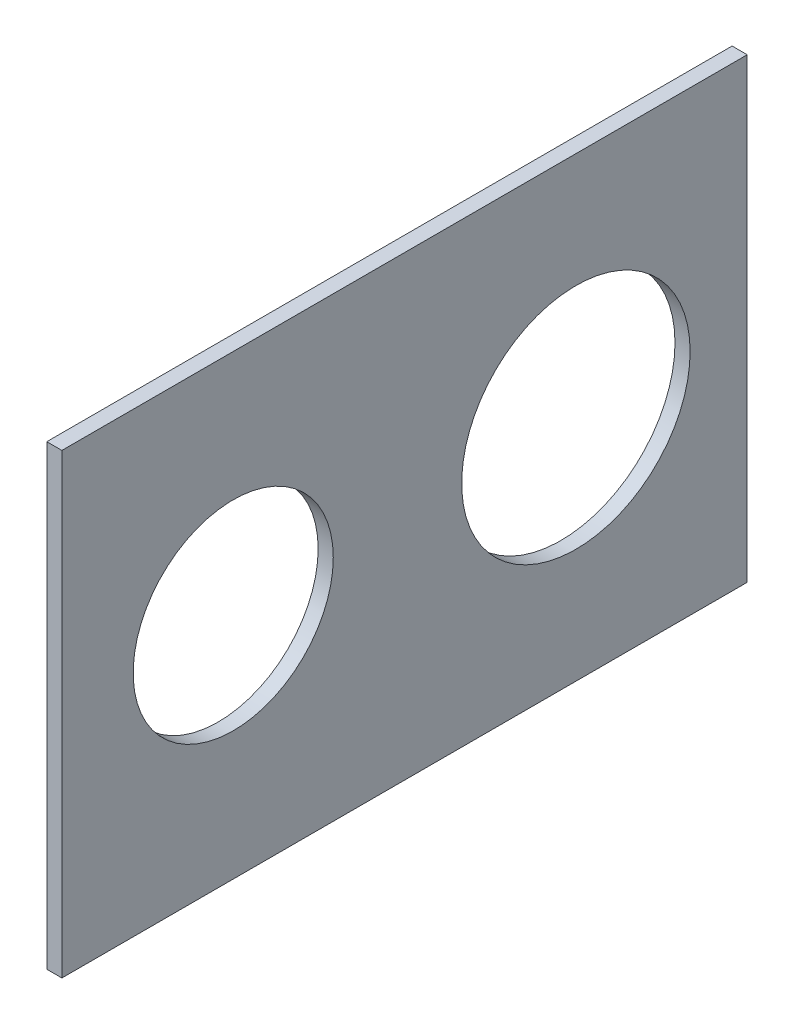
ISO-10303-21;
HEADER;
FILE_DESCRIPTION(('STEP AP214'),'2;1');
FILE_NAME('part.step','',(''),(''),'','','');
FILE_SCHEMA(('AUTOMOTIVE_DESIGN { 1 0 10303 214 1 1 1 1 }'));
ENDSEC;
DATA;
#1=APPLICATION_CONTEXT('core data for automotive mechanical design processes');
#2=APPLICATION_PROTOCOL_DEFINITION('international standard','automotive_design',2000,#1);
#3=PRODUCT_CONTEXT('',#1,'mechanical');
#4=PRODUCT('Part','Part','',(#3));
#5=PRODUCT_RELATED_PRODUCT_CATEGORY('part','',(#4));
#6=PRODUCT_DEFINITION_FORMATION('','',#4);
#7=PRODUCT_DEFINITION_CONTEXT('part definition',#1,'design');
#8=PRODUCT_DEFINITION('design','',#6,#7);
#9=PRODUCT_DEFINITION_SHAPE('','',#8);
#10=(LENGTH_UNIT() NAMED_UNIT(*) SI_UNIT(.MILLI.,.METRE.));
#11=(NAMED_UNIT(*) PLANE_ANGLE_UNIT() SI_UNIT($,.RADIAN.));
#12=(NAMED_UNIT(*) SI_UNIT($,.STERADIAN.) SOLID_ANGLE_UNIT());
#13=UNCERTAINTY_MEASURE_WITH_UNIT(LENGTH_MEASURE(1.E-05),#10,'distance_accuracy_value','');
#14=(GEOMETRIC_REPRESENTATION_CONTEXT(3) GLOBAL_UNCERTAINTY_ASSIGNED_CONTEXT((#13)) GLOBAL_UNIT_ASSIGNED_CONTEXT((#10,
#11,#12)) REPRESENTATION_CONTEXT('',''));
#15=CARTESIAN_POINT('',(0.,0.,0.));
#16=DIRECTION('',(0.,0.,1.));
#17=DIRECTION('',(1.,0.,0.));
#18=AXIS2_PLACEMENT_3D('',#15,#16,#17);
#19=CARTESIAN_POINT('',(1.68121921487946,0.,0.));
#20=DIRECTION('',(0.,0.,1.));
#21=DIRECTION('',(1.,0.,0.));
#22=AXIS2_PLACEMENT_3D('',#19,#20,#21);
#23=PLANE('',#22);
#24=DIRECTION('',(0.,1.,0.));
#25=VECTOR('',#24,1.);
#26=CARTESIAN_POINT('',(0.,0.,0.));
#27=LINE('',#26,#25);
#28=CARTESIAN_POINT('',(0.,0.,0.));
#29=VERTEX_POINT('',#28);
#30=CARTESIAN_POINT('',(0.,50.8,0.));
#31=VERTEX_POINT('',#30);
#32=EDGE_CURVE('E116',#29,#31,#27,.T.);
#33=ORIENTED_EDGE('',*,*,#32,.T.);
#34=DIRECTION('',(-1.,0.,0.));
#35=VECTOR('',#34,1.);
#36=CARTESIAN_POINT('',(1.68121921487946,50.8,0.));
#37=LINE('',#36,#35);
#38=CARTESIAN_POINT('',(1.68121921487946,50.8,0.));
#39=VERTEX_POINT('',#38);
#40=EDGE_CURVE('E11',#39,#31,#37,.T.);
#41=ORIENTED_EDGE('',*,*,#40,.F.);
#42=DIRECTION('',(0.,1.,0.));
#43=VECTOR('',#42,1.);
#44=CARTESIAN_POINT('',(1.68121921487946,0.,0.));
#45=LINE('',#44,#43);
#46=CARTESIAN_POINT('',(1.68121921487946,0.,0.));
#47=VERTEX_POINT('',#46);
#48=EDGE_CURVE('E97',#47,#39,#45,.T.);
#49=ORIENTED_EDGE('',*,*,#48,.F.);
#50=DIRECTION('',(-1.,0.,0.));
#51=VECTOR('',#50,1.);
#52=CARTESIAN_POINT('',(1.68121921487946,0.,0.));
#53=LINE('',#52,#51);
#54=EDGE_CURVE('E68',#47,#29,#53,.T.);
#55=ORIENTED_EDGE('',*,*,#54,.T.);
#56=EDGE_LOOP('',(#33,#41,#49,#55));
#57=FACE_BOUND('',#56,.T.);
#58=ADVANCED_FACE('F47',(#57),#23,.F.);
#59=CARTESIAN_POINT('',(1.68121921487946,50.8,0.));
#60=DIRECTION('',(0.,-1.,0.));
#61=DIRECTION('',(0.,0.,-1.));
#62=AXIS2_PLACEMENT_3D('',#59,#60,#61);
#63=PLANE('',#62);
#64=DIRECTION('',(0.,0.,1.));
#65=VECTOR('',#64,1.);
#66=CARTESIAN_POINT('',(0.,50.8,0.));
#67=LINE('',#66,#65);
#68=CARTESIAN_POINT('',(0.,50.8,76.2));
#69=VERTEX_POINT('',#68);
#70=EDGE_CURVE('E104',#31,#69,#67,.T.);
#71=ORIENTED_EDGE('',*,*,#70,.T.);
#72=DIRECTION('',(-1.,0.,0.));
#73=VECTOR('',#72,1.);
#74=CARTESIAN_POINT('',(1.68121921487946,50.8,76.2));
#75=LINE('',#74,#73);
#76=CARTESIAN_POINT('',(1.68121921487946,50.8,76.2));
#77=VERTEX_POINT('',#76);
#78=EDGE_CURVE('E59',#77,#69,#75,.T.);
#79=ORIENTED_EDGE('',*,*,#78,.F.);
#80=DIRECTION('',(0.,0.,1.));
#81=VECTOR('',#80,1.);
#82=CARTESIAN_POINT('',(1.68121921487946,50.8,0.));
#83=LINE('',#82,#81);
#84=EDGE_CURVE('E93',#39,#77,#83,.T.);
#85=ORIENTED_EDGE('',*,*,#84,.F.);
#86=ORIENTED_EDGE('',*,*,#40,.T.);
#87=EDGE_LOOP('',(#71,#79,#85,#86));
#88=FACE_BOUND('',#87,.T.);
#89=ADVANCED_FACE('F102',(#88),#63,.F.);
#90=CARTESIAN_POINT('',(1.68121921487946,0.,76.2));
#91=DIRECTION('',(0.,0.,1.));
#92=DIRECTION('',(1.,0.,0.));
#93=AXIS2_PLACEMENT_3D('',#90,#91,#92);
#94=PLANE('',#93);
#95=DIRECTION('',(0.,1.,0.));
#96=VECTOR('',#95,1.);
#97=CARTESIAN_POINT('',(0.,0.,76.2));
#98=LINE('',#97,#96);
#99=CARTESIAN_POINT('',(0.,0.,76.2));
#100=VERTEX_POINT('',#99);
#101=EDGE_CURVE('E122',#100,#69,#98,.T.);
#102=ORIENTED_EDGE('',*,*,#101,.F.);
#103=DIRECTION('',(-1.,0.,0.));
#104=VECTOR('',#103,1.);
#105=CARTESIAN_POINT('',(1.68121921487946,0.,76.2));
#106=LINE('',#105,#104);
#107=CARTESIAN_POINT('',(1.68121921487946,0.,76.2));
#108=VERTEX_POINT('',#107);
#109=EDGE_CURVE('E77',#108,#100,#106,.T.);
#110=ORIENTED_EDGE('',*,*,#109,.F.);
#111=DIRECTION('',(0.,1.,0.));
#112=VECTOR('',#111,1.);
#113=CARTESIAN_POINT('',(1.68121921487946,0.,76.2));
#114=LINE('',#113,#112);
#115=EDGE_CURVE('E98',#108,#77,#114,.T.);
#116=ORIENTED_EDGE('',*,*,#115,.T.);
#117=ORIENTED_EDGE('',*,*,#78,.T.);
#118=EDGE_LOOP('',(#102,#110,#116,#117));
#119=FACE_BOUND('',#118,.T.);
#120=ADVANCED_FACE('F108',(#119),#94,.T.);
#121=CARTESIAN_POINT('',(1.68121921487946,0.,0.));
#122=DIRECTION('',(0.,-1.,0.));
#123=DIRECTION('',(0.,0.,-1.));
#124=AXIS2_PLACEMENT_3D('',#121,#122,#123);
#125=PLANE('',#124);
#126=DIRECTION('',(0.,0.,1.));
#127=VECTOR('',#126,1.);
#128=CARTESIAN_POINT('',(0.,0.,0.));
#129=LINE('',#128,#127);
#130=EDGE_CURVE('E127',#29,#100,#129,.T.);
#131=ORIENTED_EDGE('',*,*,#130,.F.);
#132=ORIENTED_EDGE('',*,*,#54,.F.);
#133=DIRECTION('',(0.,0.,1.));
#134=VECTOR('',#133,1.);
#135=CARTESIAN_POINT('',(1.68121921487946,0.,0.));
#136=LINE('',#135,#134);
#137=EDGE_CURVE('E112',#47,#108,#136,.T.);
#138=ORIENTED_EDGE('',*,*,#137,.T.);
#139=ORIENTED_EDGE('',*,*,#109,.T.);
#140=EDGE_LOOP('',(#131,#132,#138,#139));
#141=FACE_BOUND('',#140,.T.);
#142=ADVANCED_FACE('F163',(#141),#125,.T.);
#143=CARTESIAN_POINT('',(1.68121921487946,0.,0.));
#144=DIRECTION('',(1.,0.,0.));
#145=DIRECTION('',(0.,0.,-1.));
#146=AXIS2_PLACEMENT_3D('',#143,#144,#145);
#147=PLANE('',#146);
#148=CARTESIAN_POINT('',(1.68121921487946,25.4,57.15));
#149=DIRECTION('',(1.,0.,0.));
#150=DIRECTION('',(0.,0.,-1.));
#151=AXIS2_PLACEMENT_3D('',#148,#149,#150);
#152=CIRCLE('',#151,11.1252);
#153=CARTESIAN_POINT('',(1.68121921487946,25.4,46.0248));
#154=VERTEX_POINT('',#153);
#155=EDGE_CURVE('E145',#154,#154,#152,.T.);
#156=ORIENTED_EDGE('',*,*,#155,.F.);
#157=EDGE_LOOP('',(#156));
#158=FACE_BOUND('',#157,.T.);
#159=CARTESIAN_POINT('',(1.68121921487946,25.4,19.05));
#160=DIRECTION('',(1.,0.,0.));
#161=DIRECTION('',(0.,0.,-1.));
#162=AXIS2_PLACEMENT_3D('',#159,#160,#161);
#163=CIRCLE('',#162,12.7);
#164=CARTESIAN_POINT('',(1.68121921487946,25.4,6.35));
#165=VERTEX_POINT('',#164);
#166=EDGE_CURVE('E136',#165,#165,#163,.T.);
#167=ORIENTED_EDGE('',*,*,#166,.F.);
#168=EDGE_LOOP('',(#167));
#169=FACE_BOUND('',#168,.T.);
#170=ORIENTED_EDGE('',*,*,#48,.T.);
#171=ORIENTED_EDGE('',*,*,#84,.T.);
#172=ORIENTED_EDGE('',*,*,#115,.F.);
#173=ORIENTED_EDGE('',*,*,#137,.F.);
#174=EDGE_LOOP('',(#170,#171,#172,#173));
#175=FACE_BOUND('',#174,.T.);
#176=ADVANCED_FACE('F92',(#158,#169,#175),#147,.T.);
#177=CARTESIAN_POINT('',(0.,0.,0.));
#178=DIRECTION('',(1.,0.,0.));
#179=DIRECTION('',(0.,0.,-1.));
#180=AXIS2_PLACEMENT_3D('',#177,#178,#179);
#181=PLANE('',#180);
#182=CARTESIAN_POINT('',(0.,25.4,57.15));
#183=DIRECTION('',(1.,0.,0.));
#184=DIRECTION('',(0.,0.,-1.));
#185=AXIS2_PLACEMENT_3D('',#182,#183,#184);
#186=CIRCLE('',#185,11.1252);
#187=CARTESIAN_POINT('',(0.,25.4,46.0248));
#188=VERTEX_POINT('',#187);
#189=EDGE_CURVE('E117',#188,#188,#186,.T.);
#190=ORIENTED_EDGE('',*,*,#189,.T.);
#191=EDGE_LOOP('',(#190));
#192=FACE_BOUND('',#191,.T.);
#193=CARTESIAN_POINT('',(0.,25.4,19.05));
#194=DIRECTION('',(1.,0.,0.));
#195=DIRECTION('',(0.,0.,-1.));
#196=AXIS2_PLACEMENT_3D('',#193,#194,#195);
#197=CIRCLE('',#196,12.7);
#198=CARTESIAN_POINT('',(0.,25.4,6.35));
#199=VERTEX_POINT('',#198);
#200=EDGE_CURVE('E138',#199,#199,#197,.T.);
#201=ORIENTED_EDGE('',*,*,#200,.T.);
#202=EDGE_LOOP('',(#201));
#203=FACE_BOUND('',#202,.T.);
#204=ORIENTED_EDGE('',*,*,#32,.F.);
#205=ORIENTED_EDGE('',*,*,#130,.T.);
#206=ORIENTED_EDGE('',*,*,#101,.T.);
#207=ORIENTED_EDGE('',*,*,#70,.F.);
#208=EDGE_LOOP('',(#204,#205,#206,#207));
#209=FACE_BOUND('',#208,.T.);
#210=ADVANCED_FACE('F155',(#192,#203,#209),#181,.F.);
#211=CARTESIAN_POINT('',(0.,25.4,19.05));
#212=DIRECTION('',(1.,0.,0.));
#213=DIRECTION('',(0.,0.,-1.));
#214=AXIS2_PLACEMENT_3D('',#211,#212,#213);
#215=CYLINDRICAL_SURFACE('',#214,12.7);
#216=ORIENTED_EDGE('',*,*,#200,.F.);
#217=EDGE_LOOP('',(#216));
#218=FACE_BOUND('',#217,.T.);
#219=ORIENTED_EDGE('',*,*,#166,.T.);
#220=EDGE_LOOP('',(#219));
#221=FACE_BOUND('',#220,.T.);
#222=ADVANCED_FACE('F158',(#218,#221),#215,.F.);
#223=CARTESIAN_POINT('',(0.,25.4,57.15));
#224=DIRECTION('',(1.,0.,0.));
#225=DIRECTION('',(0.,0.,-1.));
#226=AXIS2_PLACEMENT_3D('',#223,#224,#225);
#227=CYLINDRICAL_SURFACE('',#226,11.1252);
#228=ORIENTED_EDGE('',*,*,#189,.F.);
#229=EDGE_LOOP('',(#228));
#230=FACE_BOUND('',#229,.T.);
#231=ORIENTED_EDGE('',*,*,#155,.T.);
#232=EDGE_LOOP('',(#231));
#233=FACE_BOUND('',#232,.T.);
#234=ADVANCED_FACE('F154',(#230,#233),#227,.F.);
#235=CLOSED_SHELL('',(#58,#89,#120,#142,#176,#210,#222,#234));
#236=MANIFOLD_SOLID_BREP('B2',#235);
#237=ADVANCED_BREP_SHAPE_REPRESENTATION('',(#18,#236),#14);
#238=SHAPE_DEFINITION_REPRESENTATION(#9,#237);
ENDSEC;
END-ISO-10303-21;
